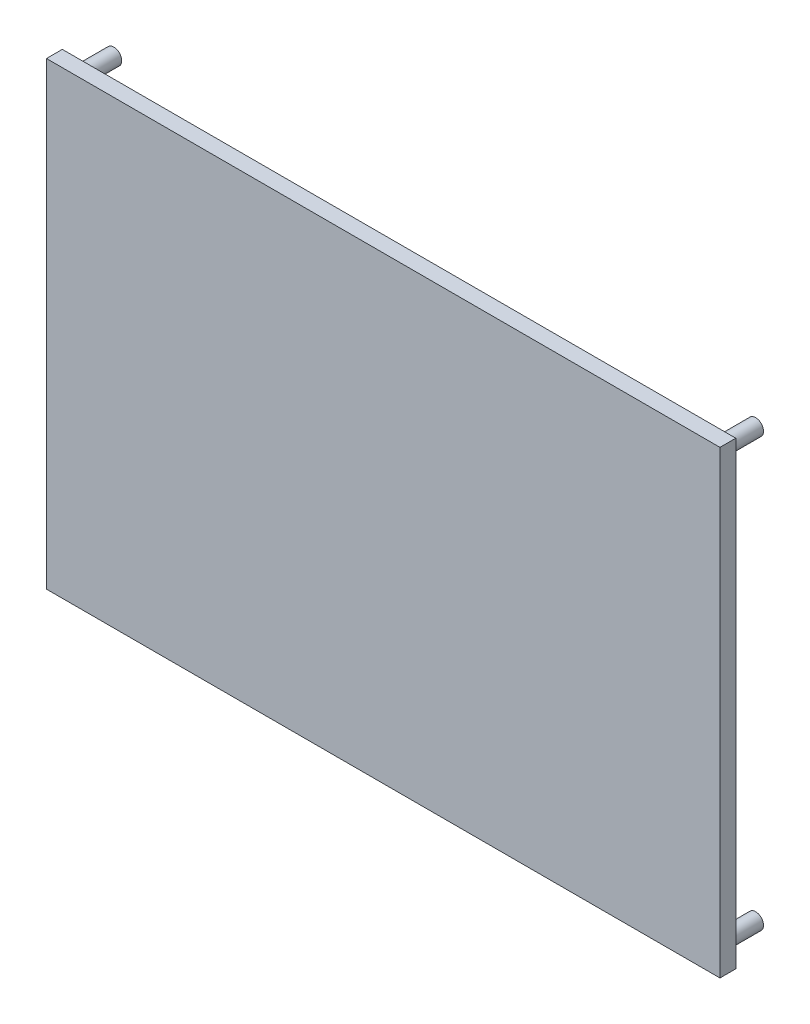
ISO-10303-21;
HEADER;
FILE_DESCRIPTION(('STEP AP214'),'2;1');
FILE_NAME('part.step','',(''),(''),'','','');
FILE_SCHEMA(('AUTOMOTIVE_DESIGN { 1 0 10303 214 1 1 1 1 }'));
ENDSEC;
DATA;
#1=APPLICATION_CONTEXT('core data for automotive mechanical design processes');
#2=APPLICATION_PROTOCOL_DEFINITION('international standard','automotive_design',2000,#1);
#3=PRODUCT_CONTEXT('',#1,'mechanical');
#4=PRODUCT('Part','Part','',(#3));
#5=PRODUCT_RELATED_PRODUCT_CATEGORY('part','',(#4));
#6=PRODUCT_DEFINITION_FORMATION('','',#4);
#7=PRODUCT_DEFINITION_CONTEXT('part definition',#1,'design');
#8=PRODUCT_DEFINITION('design','',#6,#7);
#9=PRODUCT_DEFINITION_SHAPE('','',#8);
#10=(LENGTH_UNIT() NAMED_UNIT(*) SI_UNIT(.MILLI.,.METRE.));
#11=(NAMED_UNIT(*) PLANE_ANGLE_UNIT() SI_UNIT($,.RADIAN.));
#12=(NAMED_UNIT(*) SI_UNIT($,.STERADIAN.) SOLID_ANGLE_UNIT());
#13=UNCERTAINTY_MEASURE_WITH_UNIT(LENGTH_MEASURE(1.E-05),#10,'distance_accuracy_value','');
#14=(GEOMETRIC_REPRESENTATION_CONTEXT(3) GLOBAL_UNCERTAINTY_ASSIGNED_CONTEXT((#13)) GLOBAL_UNIT_ASSIGNED_CONTEXT((#10,
#11,#12)) REPRESENTATION_CONTEXT('',''));
#15=CARTESIAN_POINT('',(0.,0.,0.));
#16=DIRECTION('',(0.,0.,1.));
#17=DIRECTION('',(1.,0.,0.));
#18=AXIS2_PLACEMENT_3D('',#15,#16,#17);
#19=CARTESIAN_POINT('',(0.,0.,2.));
#20=DIRECTION('',(-1.,0.,0.));
#21=DIRECTION('',(0.,0.,1.));
#22=AXIS2_PLACEMENT_3D('',#19,#20,#21);
#23=PLANE('',#22);
#24=DIRECTION('',(0.,1.,0.));
#25=VECTOR('',#24,1.);
#26=CARTESIAN_POINT('',(0.,0.,0.));
#27=LINE('',#26,#25);
#28=CARTESIAN_POINT('',(0.,0.,0.));
#29=VERTEX_POINT('',#28);
#30=CARTESIAN_POINT('',(0.,58.,0.));
#31=VERTEX_POINT('',#30);
#32=EDGE_CURVE('E112',#29,#31,#27,.T.);
#33=ORIENTED_EDGE('',*,*,#32,.T.);
#34=DIRECTION('',(0.,0.,-1.));
#35=VECTOR('',#34,1.);
#36=CARTESIAN_POINT('',(0.,58.,2.));
#37=LINE('',#36,#35);
#38=CARTESIAN_POINT('',(0.,58.,2.));
#39=VERTEX_POINT('',#38);
#40=EDGE_CURVE('E11',#39,#31,#37,.T.);
#41=ORIENTED_EDGE('',*,*,#40,.F.);
#42=DIRECTION('',(0.,1.,0.));
#43=VECTOR('',#42,1.);
#44=CARTESIAN_POINT('',(0.,0.,2.));
#45=LINE('',#44,#43);
#46=CARTESIAN_POINT('',(0.,0.,2.));
#47=VERTEX_POINT('',#46);
#48=EDGE_CURVE('E95',#47,#39,#45,.T.);
#49=ORIENTED_EDGE('',*,*,#48,.F.);
#50=DIRECTION('',(0.,0.,-1.));
#51=VECTOR('',#50,1.);
#52=CARTESIAN_POINT('',(0.,0.,2.));
#53=LINE('',#52,#51);
#54=EDGE_CURVE('E108',#47,#29,#53,.T.);
#55=ORIENTED_EDGE('',*,*,#54,.T.);
#56=EDGE_LOOP('',(#33,#41,#49,#55));
#57=FACE_BOUND('',#56,.T.);
#58=ADVANCED_FACE('F41',(#57),#23,.F.);
#59=CARTESIAN_POINT('',(0.,58.,2.));
#60=DIRECTION('',(0.,-1.,0.));
#61=DIRECTION('',(1.,0.,0.));
#62=AXIS2_PLACEMENT_3D('',#59,#60,#61);
#63=PLANE('',#62);
#64=DIRECTION('',(-1.,0.,0.));
#65=VECTOR('',#64,1.);
#66=CARTESIAN_POINT('',(0.,58.,0.));
#67=LINE('',#66,#65);
#68=CARTESIAN_POINT('',(-85.,58.,0.));
#69=VERTEX_POINT('',#68);
#70=EDGE_CURVE('E100',#31,#69,#67,.T.);
#71=ORIENTED_EDGE('',*,*,#70,.T.);
#72=DIRECTION('',(0.,0.,-1.));
#73=VECTOR('',#72,1.);
#74=CARTESIAN_POINT('',(-85.,58.,2.));
#75=LINE('',#74,#73);
#76=CARTESIAN_POINT('',(-85.,58.,2.));
#77=VERTEX_POINT('',#76);
#78=EDGE_CURVE('E51',#77,#69,#75,.T.);
#79=ORIENTED_EDGE('',*,*,#78,.F.);
#80=DIRECTION('',(-1.,0.,0.));
#81=VECTOR('',#80,1.);
#82=CARTESIAN_POINT('',(0.,58.,2.));
#83=LINE('',#82,#81);
#84=EDGE_CURVE('E90',#39,#77,#83,.T.);
#85=ORIENTED_EDGE('',*,*,#84,.F.);
#86=ORIENTED_EDGE('',*,*,#40,.T.);
#87=EDGE_LOOP('',(#71,#79,#85,#86));
#88=FACE_BOUND('',#87,.T.);
#89=ADVANCED_FACE('F99',(#88),#63,.F.);
#90=CARTESIAN_POINT('',(-85.,0.,2.));
#91=DIRECTION('',(1.,0.,0.));
#92=DIRECTION('',(0.,0.,-1.));
#93=AXIS2_PLACEMENT_3D('',#90,#91,#92);
#94=PLANE('',#93);
#95=DIRECTION('',(0.,-1.,0.));
#96=VECTOR('',#95,1.);
#97=CARTESIAN_POINT('',(-85.,0.,0.));
#98=LINE('',#97,#96);
#99=CARTESIAN_POINT('',(-85.,0.,0.));
#100=VERTEX_POINT('',#99);
#101=EDGE_CURVE('E77',#69,#100,#98,.T.);
#102=ORIENTED_EDGE('',*,*,#101,.T.);
#103=DIRECTION('',(0.,0.,-1.));
#104=VECTOR('',#103,1.);
#105=CARTESIAN_POINT('',(-85.,0.,2.));
#106=LINE('',#105,#104);
#107=CARTESIAN_POINT('',(-85.,0.,2.));
#108=VERTEX_POINT('',#107);
#109=EDGE_CURVE('E102',#108,#100,#106,.T.);
#110=ORIENTED_EDGE('',*,*,#109,.F.);
#111=DIRECTION('',(0.,-1.,0.));
#112=VECTOR('',#111,1.);
#113=CARTESIAN_POINT('',(-85.,0.,2.));
#114=LINE('',#113,#112);
#115=EDGE_CURVE('E93',#77,#108,#114,.T.);
#116=ORIENTED_EDGE('',*,*,#115,.F.);
#117=ORIENTED_EDGE('',*,*,#78,.T.);
#118=EDGE_LOOP('',(#102,#110,#116,#117));
#119=FACE_BOUND('',#118,.T.);
#120=ADVANCED_FACE('F104',(#119),#94,.F.);
#121=CARTESIAN_POINT('',(0.,0.,2.));
#122=DIRECTION('',(0.,1.,0.));
#123=DIRECTION('',(0.,0.,1.));
#124=AXIS2_PLACEMENT_3D('',#121,#122,#123);
#125=PLANE('',#124);
#126=DIRECTION('',(1.,0.,0.));
#127=VECTOR('',#126,1.);
#128=CARTESIAN_POINT('',(0.,0.,0.));
#129=LINE('',#128,#127);
#130=EDGE_CURVE('E83',#100,#29,#129,.T.);
#131=ORIENTED_EDGE('',*,*,#130,.T.);
#132=ORIENTED_EDGE('',*,*,#54,.F.);
#133=DIRECTION('',(1.,0.,0.));
#134=VECTOR('',#133,1.);
#135=CARTESIAN_POINT('',(0.,0.,2.));
#136=LINE('',#135,#134);
#137=EDGE_CURVE('E60',#108,#47,#136,.T.);
#138=ORIENTED_EDGE('',*,*,#137,.F.);
#139=ORIENTED_EDGE('',*,*,#109,.T.);
#140=EDGE_LOOP('',(#131,#132,#138,#139));
#141=FACE_BOUND('',#140,.T.);
#142=ADVANCED_FACE('F188',(#141),#125,.F.);
#143=CARTESIAN_POINT('',(0.,0.,2.));
#144=DIRECTION('',(0.,0.,1.));
#145=DIRECTION('',(1.,0.,0.));
#146=AXIS2_PLACEMENT_3D('',#143,#144,#145);
#147=PLANE('',#146);
#148=ORIENTED_EDGE('',*,*,#48,.T.);
#149=ORIENTED_EDGE('',*,*,#84,.T.);
#150=ORIENTED_EDGE('',*,*,#115,.T.);
#151=ORIENTED_EDGE('',*,*,#137,.T.);
#152=EDGE_LOOP('',(#148,#149,#150,#151));
#153=FACE_BOUND('',#152,.T.);
#154=ADVANCED_FACE('F91',(#153),#147,.T.);
#155=CARTESIAN_POINT('',(0.,0.,0.));
#156=DIRECTION('',(0.,0.,1.));
#157=DIRECTION('',(1.,0.,0.));
#158=AXIS2_PLACEMENT_3D('',#155,#156,#157);
#159=PLANE('',#158);
#160=CARTESIAN_POINT('',(-2.,2.,0.));
#161=DIRECTION('',(0.,0.,1.));
#162=DIRECTION('',(1.,0.,0.));
#163=AXIS2_PLACEMENT_3D('',#160,#161,#162);
#164=CIRCLE('',#163,0.999999999999998);
#165=CARTESIAN_POINT('',(-1.,2.,0.));
#166=VERTEX_POINT('',#165);
#167=EDGE_CURVE('E44',#166,#166,#164,.T.);
#168=ORIENTED_EDGE('',*,*,#167,.T.);
#169=EDGE_LOOP('',(#168));
#170=FACE_BOUND('',#169,.T.);
#171=CARTESIAN_POINT('',(-2.,56.,0.));
#172=DIRECTION('',(0.,0.,1.));
#173=DIRECTION('',(1.,0.,0.));
#174=AXIS2_PLACEMENT_3D('',#171,#172,#173);
#175=CIRCLE('',#174,0.999999999999999);
#176=CARTESIAN_POINT('',(-1.,56.,0.));
#177=VERTEX_POINT('',#176);
#178=EDGE_CURVE('E135',#177,#177,#175,.T.);
#179=ORIENTED_EDGE('',*,*,#178,.T.);
#180=EDGE_LOOP('',(#179));
#181=FACE_BOUND('',#180,.T.);
#182=CARTESIAN_POINT('',(-83.,2.,0.));
#183=DIRECTION('',(0.,0.,1.));
#184=DIRECTION('',(1.,0.,0.));
#185=AXIS2_PLACEMENT_3D('',#182,#183,#184);
#186=CIRCLE('',#185,0.999999999999998);
#187=CARTESIAN_POINT('',(-82.,2.,0.));
#188=VERTEX_POINT('',#187);
#189=EDGE_CURVE('E131',#188,#188,#186,.T.);
#190=ORIENTED_EDGE('',*,*,#189,.T.);
#191=EDGE_LOOP('',(#190));
#192=FACE_BOUND('',#191,.T.);
#193=CARTESIAN_POINT('',(-83.,56.,0.));
#194=DIRECTION('',(0.,0.,1.));
#195=DIRECTION('',(1.,0.,0.));
#196=AXIS2_PLACEMENT_3D('',#193,#194,#195);
#197=CIRCLE('',#196,0.999999999999998);
#198=CARTESIAN_POINT('',(-82.,56.,0.));
#199=VERTEX_POINT('',#198);
#200=EDGE_CURVE('E116',#199,#199,#197,.T.);
#201=ORIENTED_EDGE('',*,*,#200,.T.);
#202=EDGE_LOOP('',(#201));
#203=FACE_BOUND('',#202,.T.);
#204=ORIENTED_EDGE('',*,*,#32,.F.);
#205=ORIENTED_EDGE('',*,*,#130,.F.);
#206=ORIENTED_EDGE('',*,*,#101,.F.);
#207=ORIENTED_EDGE('',*,*,#70,.F.);
#208=EDGE_LOOP('',(#204,#205,#206,#207));
#209=FACE_BOUND('',#208,.T.);
#210=ADVANCED_FACE('F173',(#170,#181,#192,#203,#209),#159,.F.);
#211=CARTESIAN_POINT('',(-83.,56.,-4.5));
#212=DIRECTION('',(0.,0.,1.));
#213=DIRECTION('',(1.,0.,0.));
#214=AXIS2_PLACEMENT_3D('',#211,#212,#213);
#215=CYLINDRICAL_SURFACE('',#214,0.999999999999998);
#216=CARTESIAN_POINT('',(-83.,56.,-4.5));
#217=DIRECTION('',(0.,0.,1.));
#218=DIRECTION('',(1.,0.,0.));
#219=AXIS2_PLACEMENT_3D('',#216,#217,#218);
#220=CIRCLE('',#219,0.999999999999998);
#221=CARTESIAN_POINT('',(-82.,56.,-4.5));
#222=VERTEX_POINT('',#221);
#223=EDGE_CURVE('E130',#222,#222,#220,.T.);
#224=CARTESIAN_POINT('',(-82.,56.,-4.5));
#225=CARTESIAN_POINT('',(-82.,56.,-4.453125));
#226=CARTESIAN_POINT('',(-82.,56.,-4.40625));
#227=CARTESIAN_POINT('',(-82.,56.,-4.3125));
#228=CARTESIAN_POINT('',(-82.,56.,-4.265625));
#229=CARTESIAN_POINT('',(-82.,56.,-4.171875));
#230=CARTESIAN_POINT('',(-82.,56.,-4.125));
#231=CARTESIAN_POINT('',(-82.,56.,-4.03125));
#232=CARTESIAN_POINT('',(-82.,56.,-3.984375));
#233=CARTESIAN_POINT('',(-82.,56.,-3.890625));
#234=CARTESIAN_POINT('',(-82.,56.,-3.84375));
#235=CARTESIAN_POINT('',(-82.,56.,-3.75));
#236=CARTESIAN_POINT('',(-82.,56.,-3.703125));
#237=CARTESIAN_POINT('',(-82.,56.,-3.609375));
#238=CARTESIAN_POINT('',(-82.,56.,-3.5625));
#239=CARTESIAN_POINT('',(-82.,56.,-3.46875));
#240=CARTESIAN_POINT('',(-82.,56.,-3.421875));
#241=CARTESIAN_POINT('',(-82.,56.,-3.328125));
#242=CARTESIAN_POINT('',(-82.,56.,-3.28125));
#243=CARTESIAN_POINT('',(-82.,56.,-3.1875));
#244=CARTESIAN_POINT('',(-82.,56.,-3.140625));
#245=CARTESIAN_POINT('',(-82.,56.,-3.046875));
#246=CARTESIAN_POINT('',(-82.,56.,-3.));
#247=CARTESIAN_POINT('',(-82.,56.,-2.90625));
#248=CARTESIAN_POINT('',(-82.,56.,-2.859375));
#249=CARTESIAN_POINT('',(-82.,56.,-2.765625));
#250=CARTESIAN_POINT('',(-82.,56.,-2.71875));
#251=CARTESIAN_POINT('',(-82.,56.,-2.625));
#252=CARTESIAN_POINT('',(-82.,56.,-2.578125));
#253=CARTESIAN_POINT('',(-82.,56.,-2.484375));
#254=CARTESIAN_POINT('',(-82.,56.,-2.4375));
#255=CARTESIAN_POINT('',(-82.,56.,-2.34375));
#256=CARTESIAN_POINT('',(-82.,56.,-2.296875));
#257=CARTESIAN_POINT('',(-82.,56.,-2.203125));
#258=CARTESIAN_POINT('',(-82.,56.,-2.15625));
#259=CARTESIAN_POINT('',(-82.,56.,-2.0625));
#260=CARTESIAN_POINT('',(-82.,56.,-2.015625));
#261=CARTESIAN_POINT('',(-82.,56.,-1.921875));
#262=CARTESIAN_POINT('',(-82.,56.,-1.875));
#263=CARTESIAN_POINT('',(-82.,56.,-1.78125));
#264=CARTESIAN_POINT('',(-82.,56.,-1.734375));
#265=CARTESIAN_POINT('',(-82.,56.,-1.640625));
#266=CARTESIAN_POINT('',(-82.,56.,-1.59375));
#267=CARTESIAN_POINT('',(-82.,56.,-1.5));
#268=CARTESIAN_POINT('',(-82.,56.,-1.453125));
#269=CARTESIAN_POINT('',(-82.,56.,-1.359375));
#270=CARTESIAN_POINT('',(-82.,56.,-1.3125));
#271=CARTESIAN_POINT('',(-82.,56.,-1.21875));
#272=CARTESIAN_POINT('',(-82.,56.,-1.171875));
#273=CARTESIAN_POINT('',(-82.,56.,-1.078125));
#274=CARTESIAN_POINT('',(-82.,56.,-1.03125));
#275=CARTESIAN_POINT('',(-82.,56.,-0.9375));
#276=CARTESIAN_POINT('',(-82.,56.,-0.890624999999999));
#277=CARTESIAN_POINT('',(-82.,56.,-0.796874999999999));
#278=CARTESIAN_POINT('',(-82.,56.,-0.749999999999999));
#279=CARTESIAN_POINT('',(-82.,56.,-0.65625));
#280=CARTESIAN_POINT('',(-82.,56.,-0.609375));
#281=CARTESIAN_POINT('',(-82.,56.,-0.515625));
#282=CARTESIAN_POINT('',(-82.,56.,-0.46875));
#283=CARTESIAN_POINT('',(-82.,56.,-0.375));
#284=CARTESIAN_POINT('',(-82.,56.,-0.328125));
#285=CARTESIAN_POINT('',(-82.,56.,-0.234375));
#286=CARTESIAN_POINT('',(-82.,56.,-0.1875));
#287=CARTESIAN_POINT('',(-82.,56.,-0.0937500000000001));
#288=CARTESIAN_POINT('',(-82.,56.,-0.0468750000000001));
#289=CARTESIAN_POINT('',(-82.,56.,0.));
#290=B_SPLINE_CURVE_WITH_KNOTS('',3,(#224,#225,#226,#227,#228,#229,#230,#231,#232,#233,#234,
#235,#236,#237,#238,#239,#240,#241,#242,#243,#244,#245,#246,#247,#248,#249,#250,#251,#252,#253,
#254,#255,#256,#257,#258,#259,#260,#261,#262,#263,#264,#265,#266,#267,#268,#269,#270,#271,#272,
#273,#274,#275,#276,#277,#278,#279,#280,#281,#282,#283,#284,#285,#286,#287,#288,#289),
.UNSPECIFIED.,.F.,.F.,(4,2,2,2,2,2,2,2,2,2,2,2,2,2,2,2,2,2,2,2,2,2,2,2,2,2,2,2,2,2,2,2,4),(0.,
0.140625,0.28125,0.421875,0.5625,0.703125000000001,0.843750000000001,0.984375,1.125,1.265625,
1.40625,1.546875,1.6875,1.828125,1.96875,2.109375,2.25,2.390625,2.53125,2.671875,2.8125,
2.953125,3.09375,3.234375,3.375,3.515625,3.65625,3.796875,3.9375,4.078125,4.21875,4.359375,4.5),.UNSPECIFIED.);
#291=EDGE_CURVE('BSEAM159',#222,#199,#290,.T.);
#292=ORIENTED_EDGE('',*,*,#223,.T.);
#293=ORIENTED_EDGE('',*,*,#200,.F.);
#294=ORIENTED_EDGE('',*,*,#291,.T.);
#295=ORIENTED_EDGE('',*,*,#291,.F.);
#296=EDGE_LOOP('',(#292,#294,#293,#295));
#297=FACE_BOUND('',#296,.T.);
#298=ADVANCED_FACE('F159',(#297),#215,.T.);
#299=CARTESIAN_POINT('',(-83.,56.,-4.5));
#300=DIRECTION('',(0.,0.,1.));
#301=DIRECTION('',(1.,0.,0.));
#302=AXIS2_PLACEMENT_3D('',#299,#300,#301);
#303=PLANE('',#302);
#304=ORIENTED_EDGE('',*,*,#223,.F.);
#305=EDGE_LOOP('',(#304));
#306=FACE_BOUND('',#305,.T.);
#307=ADVANCED_FACE('F162',(#306),#303,.F.);
#308=CARTESIAN_POINT('',(-83.,2.,-4.5));
#309=DIRECTION('',(0.,0.,1.));
#310=DIRECTION('',(1.,0.,0.));
#311=AXIS2_PLACEMENT_3D('',#308,#309,#310);
#312=CYLINDRICAL_SURFACE('',#311,0.999999999999998);
#313=CARTESIAN_POINT('',(-83.,2.,-4.5));
#314=DIRECTION('',(0.,0.,1.));
#315=DIRECTION('',(1.,0.,0.));
#316=AXIS2_PLACEMENT_3D('',#313,#314,#315);
#317=CIRCLE('',#316,0.999999999999998);
#318=CARTESIAN_POINT('',(-82.,2.,-4.5));
#319=VERTEX_POINT('',#318);
#320=EDGE_CURVE('E134',#319,#319,#317,.T.);
#321=CARTESIAN_POINT('',(-82.,2.,-4.5));
#322=CARTESIAN_POINT('',(-82.,2.,-4.453125));
#323=CARTESIAN_POINT('',(-82.,2.,-4.40625));
#324=CARTESIAN_POINT('',(-82.,2.,-4.3125));
#325=CARTESIAN_POINT('',(-82.,2.,-4.265625));
#326=CARTESIAN_POINT('',(-82.,2.,-4.171875));
#327=CARTESIAN_POINT('',(-82.,2.,-4.125));
#328=CARTESIAN_POINT('',(-82.,2.,-4.03125));
#329=CARTESIAN_POINT('',(-82.,2.,-3.984375));
#330=CARTESIAN_POINT('',(-82.,2.,-3.890625));
#331=CARTESIAN_POINT('',(-82.,2.,-3.84375));
#332=CARTESIAN_POINT('',(-82.,2.,-3.75));
#333=CARTESIAN_POINT('',(-82.,2.,-3.703125));
#334=CARTESIAN_POINT('',(-82.,2.,-3.609375));
#335=CARTESIAN_POINT('',(-82.,2.,-3.5625));
#336=CARTESIAN_POINT('',(-82.,2.,-3.46875));
#337=CARTESIAN_POINT('',(-82.,2.,-3.421875));
#338=CARTESIAN_POINT('',(-82.,2.,-3.328125));
#339=CARTESIAN_POINT('',(-82.,2.,-3.28125));
#340=CARTESIAN_POINT('',(-82.,2.,-3.1875));
#341=CARTESIAN_POINT('',(-82.,2.,-3.140625));
#342=CARTESIAN_POINT('',(-82.,2.,-3.046875));
#343=CARTESIAN_POINT('',(-82.,2.,-3.));
#344=CARTESIAN_POINT('',(-82.,2.,-2.90625));
#345=CARTESIAN_POINT('',(-82.,2.,-2.859375));
#346=CARTESIAN_POINT('',(-82.,2.,-2.765625));
#347=CARTESIAN_POINT('',(-82.,2.,-2.71875));
#348=CARTESIAN_POINT('',(-82.,2.,-2.625));
#349=CARTESIAN_POINT('',(-82.,2.,-2.578125));
#350=CARTESIAN_POINT('',(-82.,2.,-2.484375));
#351=CARTESIAN_POINT('',(-82.,2.,-2.4375));
#352=CARTESIAN_POINT('',(-82.,2.,-2.34375));
#353=CARTESIAN_POINT('',(-82.,2.,-2.296875));
#354=CARTESIAN_POINT('',(-82.,2.,-2.203125));
#355=CARTESIAN_POINT('',(-82.,2.,-2.15625));
#356=CARTESIAN_POINT('',(-82.,2.,-2.0625));
#357=CARTESIAN_POINT('',(-82.,2.,-2.015625));
#358=CARTESIAN_POINT('',(-82.,2.,-1.921875));
#359=CARTESIAN_POINT('',(-82.,2.,-1.875));
#360=CARTESIAN_POINT('',(-82.,2.,-1.78125));
#361=CARTESIAN_POINT('',(-82.,2.,-1.734375));
#362=CARTESIAN_POINT('',(-82.,2.,-1.640625));
#363=CARTESIAN_POINT('',(-82.,2.,-1.59375));
#364=CARTESIAN_POINT('',(-82.,2.,-1.5));
#365=CARTESIAN_POINT('',(-82.,2.,-1.453125));
#366=CARTESIAN_POINT('',(-82.,2.,-1.359375));
#367=CARTESIAN_POINT('',(-82.,2.,-1.3125));
#368=CARTESIAN_POINT('',(-82.,2.,-1.21875));
#369=CARTESIAN_POINT('',(-82.,2.,-1.171875));
#370=CARTESIAN_POINT('',(-82.,2.,-1.078125));
#371=CARTESIAN_POINT('',(-82.,2.,-1.03125));
#372=CARTESIAN_POINT('',(-82.,2.,-0.9375));
#373=CARTESIAN_POINT('',(-82.,2.,-0.890624999999999));
#374=CARTESIAN_POINT('',(-82.,2.,-0.796874999999999));
#375=CARTESIAN_POINT('',(-82.,2.,-0.749999999999999));
#376=CARTESIAN_POINT('',(-82.,2.,-0.65625));
#377=CARTESIAN_POINT('',(-82.,2.,-0.609375));
#378=CARTESIAN_POINT('',(-82.,2.,-0.515625));
#379=CARTESIAN_POINT('',(-82.,2.,-0.46875));
#380=CARTESIAN_POINT('',(-82.,2.,-0.375));
#381=CARTESIAN_POINT('',(-82.,2.,-0.328125));
#382=CARTESIAN_POINT('',(-82.,2.,-0.234375));
#383=CARTESIAN_POINT('',(-82.,2.,-0.1875));
#384=CARTESIAN_POINT('',(-82.,2.,-0.0937500000000001));
#385=CARTESIAN_POINT('',(-82.,2.,-0.0468750000000001));
#386=CARTESIAN_POINT('',(-82.,2.,0.));
#387=B_SPLINE_CURVE_WITH_KNOTS('',3,(#321,#322,#323,#324,#325,#326,#327,#328,#329,#330,#331,
#332,#333,#334,#335,#336,#337,#338,#339,#340,#341,#342,#343,#344,#345,#346,#347,#348,#349,#350,
#351,#352,#353,#354,#355,#356,#357,#358,#359,#360,#361,#362,#363,#364,#365,#366,#367,#368,#369,
#370,#371,#372,#373,#374,#375,#376,#377,#378,#379,#380,#381,#382,#383,#384,#385,#386),
.UNSPECIFIED.,.F.,.F.,(4,2,2,2,2,2,2,2,2,2,2,2,2,2,2,2,2,2,2,2,2,2,2,2,2,2,2,2,2,2,2,2,4),(0.,
0.140625,0.28125,0.421875,0.5625,0.703125000000001,0.843750000000001,0.984375,1.125,1.265625,
1.40625,1.546875,1.6875,1.828125,1.96875,2.109375,2.25,2.390625,2.53125,2.671875,2.8125,
2.953125,3.09375,3.234375,3.375,3.515625,3.65625,3.796875,3.9375,4.078125,4.21875,4.359375,4.5),.UNSPECIFIED.);
#388=EDGE_CURVE('BSEAM164',#319,#188,#387,.T.);
#389=ORIENTED_EDGE('',*,*,#320,.T.);
#390=ORIENTED_EDGE('',*,*,#189,.F.);
#391=ORIENTED_EDGE('',*,*,#388,.T.);
#392=ORIENTED_EDGE('',*,*,#388,.F.);
#393=EDGE_LOOP('',(#389,#391,#390,#392));
#394=FACE_BOUND('',#393,.T.);
#395=ADVANCED_FACE('F164',(#394),#312,.T.);
#396=CARTESIAN_POINT('',(-83.,2.,-4.5));
#397=DIRECTION('',(0.,0.,1.));
#398=DIRECTION('',(1.,0.,0.));
#399=AXIS2_PLACEMENT_3D('',#396,#397,#398);
#400=PLANE('',#399);
#401=ORIENTED_EDGE('',*,*,#320,.F.);
#402=EDGE_LOOP('',(#401));
#403=FACE_BOUND('',#402,.T.);
#404=ADVANCED_FACE('F170',(#403),#400,.F.);
#405=CARTESIAN_POINT('',(-2.,56.,-4.5));
#406=DIRECTION('',(0.,0.,1.));
#407=DIRECTION('',(1.,0.,0.));
#408=AXIS2_PLACEMENT_3D('',#405,#406,#407);
#409=CYLINDRICAL_SURFACE('',#408,0.999999999999999);
#410=CARTESIAN_POINT('',(-2.,56.,-4.5));
#411=DIRECTION('',(0.,0.,1.));
#412=DIRECTION('',(1.,0.,0.));
#413=AXIS2_PLACEMENT_3D('',#410,#411,#412);
#414=CIRCLE('',#413,0.999999999999999);
#415=CARTESIAN_POINT('',(-1.,56.,-4.5));
#416=VERTEX_POINT('',#415);
#417=EDGE_CURVE('E138',#416,#416,#414,.T.);
#418=CARTESIAN_POINT('',(-1.,56.,-4.5));
#419=CARTESIAN_POINT('',(-1.,56.,-4.453125));
#420=CARTESIAN_POINT('',(-1.,56.,-4.40625));
#421=CARTESIAN_POINT('',(-1.,56.,-4.3125));
#422=CARTESIAN_POINT('',(-1.,56.,-4.265625));
#423=CARTESIAN_POINT('',(-1.,56.,-4.171875));
#424=CARTESIAN_POINT('',(-1.,56.,-4.125));
#425=CARTESIAN_POINT('',(-1.,56.,-4.03125));
#426=CARTESIAN_POINT('',(-1.,56.,-3.984375));
#427=CARTESIAN_POINT('',(-1.,56.,-3.890625));
#428=CARTESIAN_POINT('',(-1.,56.,-3.84375));
#429=CARTESIAN_POINT('',(-1.,56.,-3.75));
#430=CARTESIAN_POINT('',(-1.,56.,-3.703125));
#431=CARTESIAN_POINT('',(-1.,56.,-3.609375));
#432=CARTESIAN_POINT('',(-1.,56.,-3.5625));
#433=CARTESIAN_POINT('',(-1.,56.,-3.46875));
#434=CARTESIAN_POINT('',(-1.,56.,-3.421875));
#435=CARTESIAN_POINT('',(-1.,56.,-3.328125));
#436=CARTESIAN_POINT('',(-1.,56.,-3.28125));
#437=CARTESIAN_POINT('',(-1.,56.,-3.1875));
#438=CARTESIAN_POINT('',(-1.,56.,-3.140625));
#439=CARTESIAN_POINT('',(-1.,56.,-3.046875));
#440=CARTESIAN_POINT('',(-1.,56.,-3.));
#441=CARTESIAN_POINT('',(-1.,56.,-2.90625));
#442=CARTESIAN_POINT('',(-1.,56.,-2.859375));
#443=CARTESIAN_POINT('',(-1.,56.,-2.765625));
#444=CARTESIAN_POINT('',(-1.,56.,-2.71875));
#445=CARTESIAN_POINT('',(-1.,56.,-2.625));
#446=CARTESIAN_POINT('',(-1.,56.,-2.578125));
#447=CARTESIAN_POINT('',(-1.,56.,-2.484375));
#448=CARTESIAN_POINT('',(-1.,56.,-2.4375));
#449=CARTESIAN_POINT('',(-1.,56.,-2.34375));
#450=CARTESIAN_POINT('',(-1.,56.,-2.296875));
#451=CARTESIAN_POINT('',(-1.,56.,-2.203125));
#452=CARTESIAN_POINT('',(-1.,56.,-2.15625));
#453=CARTESIAN_POINT('',(-1.,56.,-2.0625));
#454=CARTESIAN_POINT('',(-1.,56.,-2.015625));
#455=CARTESIAN_POINT('',(-1.,56.,-1.921875));
#456=CARTESIAN_POINT('',(-1.,56.,-1.875));
#457=CARTESIAN_POINT('',(-1.,56.,-1.78125));
#458=CARTESIAN_POINT('',(-1.,56.,-1.734375));
#459=CARTESIAN_POINT('',(-1.,56.,-1.640625));
#460=CARTESIAN_POINT('',(-1.,56.,-1.59375));
#461=CARTESIAN_POINT('',(-1.,56.,-1.5));
#462=CARTESIAN_POINT('',(-1.,56.,-1.453125));
#463=CARTESIAN_POINT('',(-1.,56.,-1.359375));
#464=CARTESIAN_POINT('',(-1.,56.,-1.3125));
#465=CARTESIAN_POINT('',(-1.,56.,-1.21875));
#466=CARTESIAN_POINT('',(-1.,56.,-1.171875));
#467=CARTESIAN_POINT('',(-1.,56.,-1.078125));
#468=CARTESIAN_POINT('',(-1.,56.,-1.03125));
#469=CARTESIAN_POINT('',(-1.,56.,-0.9375));
#470=CARTESIAN_POINT('',(-1.,56.,-0.890624999999999));
#471=CARTESIAN_POINT('',(-1.,56.,-0.796874999999999));
#472=CARTESIAN_POINT('',(-1.,56.,-0.749999999999999));
#473=CARTESIAN_POINT('',(-1.,56.,-0.65625));
#474=CARTESIAN_POINT('',(-1.,56.,-0.609375));
#475=CARTESIAN_POINT('',(-1.,56.,-0.515625));
#476=CARTESIAN_POINT('',(-1.,56.,-0.46875));
#477=CARTESIAN_POINT('',(-1.,56.,-0.375));
#478=CARTESIAN_POINT('',(-1.,56.,-0.328125));
#479=CARTESIAN_POINT('',(-1.,56.,-0.234375));
#480=CARTESIAN_POINT('',(-1.,56.,-0.1875));
#481=CARTESIAN_POINT('',(-1.,56.,-0.0937500000000001));
#482=CARTESIAN_POINT('',(-1.,56.,-0.0468750000000001));
#483=CARTESIAN_POINT('',(-1.,56.,0.));
#484=B_SPLINE_CURVE_WITH_KNOTS('',3,(#418,#419,#420,#421,#422,#423,#424,#425,#426,#427,#428,
#429,#430,#431,#432,#433,#434,#435,#436,#437,#438,#439,#440,#441,#442,#443,#444,#445,#446,#447,
#448,#449,#450,#451,#452,#453,#454,#455,#456,#457,#458,#459,#460,#461,#462,#463,#464,#465,#466,
#467,#468,#469,#470,#471,#472,#473,#474,#475,#476,#477,#478,#479,#480,#481,#482,#483),
.UNSPECIFIED.,.F.,.F.,(4,2,2,2,2,2,2,2,2,2,2,2,2,2,2,2,2,2,2,2,2,2,2,2,2,2,2,2,2,2,2,2,4),(0.,
0.140625,0.28125,0.421875,0.5625,0.703125000000001,0.843750000000001,0.984375,1.125,1.265625,
1.40625,1.546875,1.6875,1.828125,1.96875,2.109375,2.25,2.390625,2.53125,2.671875,2.8125,
2.953125,3.09375,3.234375,3.375,3.515625,3.65625,3.796875,3.9375,4.078125,4.21875,4.359375,4.5),.UNSPECIFIED.);
#485=EDGE_CURVE('BSEAM244',#416,#177,#484,.T.);
#486=ORIENTED_EDGE('',*,*,#417,.T.);
#487=ORIENTED_EDGE('',*,*,#178,.F.);
#488=ORIENTED_EDGE('',*,*,#485,.T.);
#489=ORIENTED_EDGE('',*,*,#485,.F.);
#490=EDGE_LOOP('',(#486,#488,#487,#489));
#491=FACE_BOUND('',#490,.T.);
#492=ADVANCED_FACE('F244',(#491),#409,.T.);
#493=CARTESIAN_POINT('',(-2.,56.,-4.5));
#494=DIRECTION('',(0.,0.,1.));
#495=DIRECTION('',(1.,0.,0.));
#496=AXIS2_PLACEMENT_3D('',#493,#494,#495);
#497=PLANE('',#496);
#498=ORIENTED_EDGE('',*,*,#417,.F.);
#499=EDGE_LOOP('',(#498));
#500=FACE_BOUND('',#499,.T.);
#501=ADVANCED_FACE('F255',(#500),#497,.F.);
#502=CARTESIAN_POINT('',(-2.,2.,-4.5));
#503=DIRECTION('',(0.,0.,1.));
#504=DIRECTION('',(1.,0.,0.));
#505=AXIS2_PLACEMENT_3D('',#502,#503,#504);
#506=CYLINDRICAL_SURFACE('',#505,0.999999999999998);
#507=CARTESIAN_POINT('',(-2.,2.,-4.5));
#508=DIRECTION('',(0.,0.,1.));
#509=DIRECTION('',(1.,0.,0.));
#510=AXIS2_PLACEMENT_3D('',#507,#508,#509);
#511=CIRCLE('',#510,0.999999999999998);
#512=CARTESIAN_POINT('',(-1.,2.,-4.5));
#513=VERTEX_POINT('',#512);
#514=EDGE_CURVE('E151',#513,#513,#511,.T.);
#515=CARTESIAN_POINT('',(-1.,2.,-4.5));
#516=CARTESIAN_POINT('',(-1.,2.,-4.453125));
#517=CARTESIAN_POINT('',(-1.,2.,-4.40625));
#518=CARTESIAN_POINT('',(-1.,2.,-4.3125));
#519=CARTESIAN_POINT('',(-1.,2.,-4.265625));
#520=CARTESIAN_POINT('',(-1.,2.,-4.171875));
#521=CARTESIAN_POINT('',(-1.,2.,-4.125));
#522=CARTESIAN_POINT('',(-1.,2.,-4.03125));
#523=CARTESIAN_POINT('',(-1.,2.,-3.984375));
#524=CARTESIAN_POINT('',(-1.,2.,-3.890625));
#525=CARTESIAN_POINT('',(-1.,2.,-3.84375));
#526=CARTESIAN_POINT('',(-1.,2.,-3.75));
#527=CARTESIAN_POINT('',(-1.,2.,-3.703125));
#528=CARTESIAN_POINT('',(-1.,2.,-3.609375));
#529=CARTESIAN_POINT('',(-1.,2.,-3.5625));
#530=CARTESIAN_POINT('',(-1.,2.,-3.46875));
#531=CARTESIAN_POINT('',(-1.,2.,-3.421875));
#532=CARTESIAN_POINT('',(-1.,2.,-3.328125));
#533=CARTESIAN_POINT('',(-1.,2.,-3.28125));
#534=CARTESIAN_POINT('',(-1.,2.,-3.1875));
#535=CARTESIAN_POINT('',(-1.,2.,-3.140625));
#536=CARTESIAN_POINT('',(-1.,2.,-3.046875));
#537=CARTESIAN_POINT('',(-1.,2.,-3.));
#538=CARTESIAN_POINT('',(-1.,2.,-2.90625));
#539=CARTESIAN_POINT('',(-1.,2.,-2.859375));
#540=CARTESIAN_POINT('',(-1.,2.,-2.765625));
#541=CARTESIAN_POINT('',(-1.,2.,-2.71875));
#542=CARTESIAN_POINT('',(-1.,2.,-2.625));
#543=CARTESIAN_POINT('',(-1.,2.,-2.578125));
#544=CARTESIAN_POINT('',(-1.,2.,-2.484375));
#545=CARTESIAN_POINT('',(-1.,2.,-2.4375));
#546=CARTESIAN_POINT('',(-1.,2.,-2.34375));
#547=CARTESIAN_POINT('',(-1.,2.,-2.296875));
#548=CARTESIAN_POINT('',(-1.,2.,-2.203125));
#549=CARTESIAN_POINT('',(-1.,2.,-2.15625));
#550=CARTESIAN_POINT('',(-1.,2.,-2.0625));
#551=CARTESIAN_POINT('',(-1.,2.,-2.015625));
#552=CARTESIAN_POINT('',(-1.,2.,-1.921875));
#553=CARTESIAN_POINT('',(-1.,2.,-1.875));
#554=CARTESIAN_POINT('',(-1.,2.,-1.78125));
#555=CARTESIAN_POINT('',(-1.,2.,-1.734375));
#556=CARTESIAN_POINT('',(-1.,2.,-1.640625));
#557=CARTESIAN_POINT('',(-1.,2.,-1.59375));
#558=CARTESIAN_POINT('',(-1.,2.,-1.5));
#559=CARTESIAN_POINT('',(-1.,2.,-1.453125));
#560=CARTESIAN_POINT('',(-1.,2.,-1.359375));
#561=CARTESIAN_POINT('',(-1.,2.,-1.3125));
#562=CARTESIAN_POINT('',(-1.,2.,-1.21875));
#563=CARTESIAN_POINT('',(-1.,2.,-1.171875));
#564=CARTESIAN_POINT('',(-1.,2.,-1.078125));
#565=CARTESIAN_POINT('',(-1.,2.,-1.03125));
#566=CARTESIAN_POINT('',(-1.,2.,-0.9375));
#567=CARTESIAN_POINT('',(-1.,2.,-0.890624999999999));
#568=CARTESIAN_POINT('',(-1.,2.,-0.796874999999999));
#569=CARTESIAN_POINT('',(-1.,2.,-0.749999999999999));
#570=CARTESIAN_POINT('',(-1.,2.,-0.65625));
#571=CARTESIAN_POINT('',(-1.,2.,-0.609375));
#572=CARTESIAN_POINT('',(-1.,2.,-0.515625));
#573=CARTESIAN_POINT('',(-1.,2.,-0.46875));
#574=CARTESIAN_POINT('',(-1.,2.,-0.375));
#575=CARTESIAN_POINT('',(-1.,2.,-0.328125));
#576=CARTESIAN_POINT('',(-1.,2.,-0.234375));
#577=CARTESIAN_POINT('',(-1.,2.,-0.1875));
#578=CARTESIAN_POINT('',(-1.,2.,-0.0937500000000001));
#579=CARTESIAN_POINT('',(-1.,2.,-0.0468750000000001));
#580=CARTESIAN_POINT('',(-1.,2.,0.));
#581=B_SPLINE_CURVE_WITH_KNOTS('',3,(#515,#516,#517,#518,#519,#520,#521,#522,#523,#524,#525,
#526,#527,#528,#529,#530,#531,#532,#533,#534,#535,#536,#537,#538,#539,#540,#541,#542,#543,#544,
#545,#546,#547,#548,#549,#550,#551,#552,#553,#554,#555,#556,#557,#558,#559,#560,#561,#562,#563,
#564,#565,#566,#567,#568,#569,#570,#571,#572,#573,#574,#575,#576,#577,#578,#579,#580),
.UNSPECIFIED.,.F.,.F.,(4,2,2,2,2,2,2,2,2,2,2,2,2,2,2,2,2,2,2,2,2,2,2,2,2,2,2,2,2,2,2,2,4),(0.,
0.140625,0.28125,0.421875,0.5625,0.703125000000001,0.843750000000001,0.984375,1.125,1.265625,
1.40625,1.546875,1.6875,1.828125,1.96875,2.109375,2.25,2.390625,2.53125,2.671875,2.8125,
2.953125,3.09375,3.234375,3.375,3.515625,3.65625,3.796875,3.9375,4.078125,4.21875,4.359375,4.5),.UNSPECIFIED.);
#582=EDGE_CURVE('BSEAM265',#513,#166,#581,.T.);
#583=ORIENTED_EDGE('',*,*,#514,.T.);
#584=ORIENTED_EDGE('',*,*,#167,.F.);
#585=ORIENTED_EDGE('',*,*,#582,.T.);
#586=ORIENTED_EDGE('',*,*,#582,.F.);
#587=EDGE_LOOP('',(#583,#585,#584,#586));
#588=FACE_BOUND('',#587,.T.);
#589=ADVANCED_FACE('F265',(#588),#506,.T.);
#590=CARTESIAN_POINT('',(-2.,2.,-4.5));
#591=DIRECTION('',(0.,0.,1.));
#592=DIRECTION('',(1.,0.,0.));
#593=AXIS2_PLACEMENT_3D('',#590,#591,#592);
#594=PLANE('',#593);
#595=ORIENTED_EDGE('',*,*,#514,.F.);
#596=EDGE_LOOP('',(#595));
#597=FACE_BOUND('',#596,.T.);
#598=ADVANCED_FACE('F275',(#597),#594,.F.);
#599=CLOSED_SHELL('',(#58,#89,#120,#142,#154,#210,#298,#307,#395,#404,#492,#501,#589,#598));
#600=MANIFOLD_SOLID_BREP('B2',#599);
#601=ADVANCED_BREP_SHAPE_REPRESENTATION('',(#18,#600),#14);
#602=SHAPE_DEFINITION_REPRESENTATION(#9,#601);
ENDSEC;
END-ISO-10303-21;
